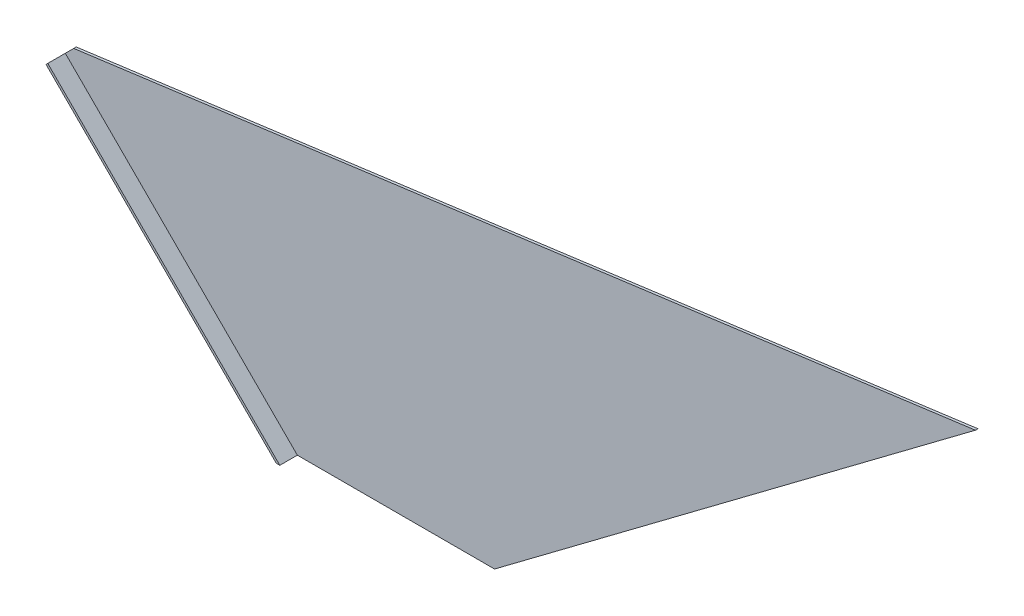
ISO-10303-21;
HEADER;
FILE_DESCRIPTION(('STEP AP214'),'2;1');
FILE_NAME('part.step','',(''),(''),'','','');
FILE_SCHEMA(('AUTOMOTIVE_DESIGN { 1 0 10303 214 1 1 1 1 }'));
ENDSEC;
DATA;
#1=APPLICATION_CONTEXT('core data for automotive mechanical design processes');
#2=APPLICATION_PROTOCOL_DEFINITION('international standard','automotive_design',2000,#1);
#3=PRODUCT_CONTEXT('',#1,'mechanical');
#4=PRODUCT('Part','Part','',(#3));
#5=PRODUCT_RELATED_PRODUCT_CATEGORY('part','',(#4));
#6=PRODUCT_DEFINITION_FORMATION('','',#4);
#7=PRODUCT_DEFINITION_CONTEXT('part definition',#1,'design');
#8=PRODUCT_DEFINITION('design','',#6,#7);
#9=PRODUCT_DEFINITION_SHAPE('','',#8);
#10=(LENGTH_UNIT() NAMED_UNIT(*) SI_UNIT(.MILLI.,.METRE.));
#11=(NAMED_UNIT(*) PLANE_ANGLE_UNIT() SI_UNIT($,.RADIAN.));
#12=(NAMED_UNIT(*) SI_UNIT($,.STERADIAN.) SOLID_ANGLE_UNIT());
#13=UNCERTAINTY_MEASURE_WITH_UNIT(LENGTH_MEASURE(1.E-05),#10,'distance_accuracy_value','');
#14=(GEOMETRIC_REPRESENTATION_CONTEXT(3) GLOBAL_UNCERTAINTY_ASSIGNED_CONTEXT((#13)) GLOBAL_UNIT_ASSIGNED_CONTEXT((#10,
#11,#12)) REPRESENTATION_CONTEXT('',''));
#15=CARTESIAN_POINT('',(0.,0.,0.));
#16=DIRECTION('',(0.,0.,1.));
#17=DIRECTION('',(1.,0.,0.));
#18=AXIS2_PLACEMENT_3D('',#15,#16,#17);
#19=CARTESIAN_POINT('',(0.,0.,1.5875));
#20=DIRECTION('',(0.,1.,0.));
#21=DIRECTION('',(0.,0.,1.));
#22=AXIS2_PLACEMENT_3D('',#19,#20,#21);
#23=PLANE('',#22);
#24=DIRECTION('',(1.,0.,0.));
#25=VECTOR('',#24,1.);
#26=CARTESIAN_POINT('',(0.,0.,0.));
#27=LINE('',#26,#25);
#28=CARTESIAN_POINT('',(-11.1175570778835,0.,0.));
#29=VERTEX_POINT('',#28);
#30=CARTESIAN_POINT('',(114.3,0.,0.));
#31=VERTEX_POINT('',#30);
#32=EDGE_CURVE('E159',#29,#31,#27,.T.);
#33=ORIENTED_EDGE('',*,*,#32,.T.);
#34=DIRECTION('',(0.,0.,-1.));
#35=VECTOR('',#34,1.);
#36=CARTESIAN_POINT('',(114.3,0.,1.5875));
#37=LINE('',#36,#35);
#38=CARTESIAN_POINT('',(114.3,0.,1.5875));
#39=VERTEX_POINT('',#38);
#40=EDGE_CURVE('E11',#39,#31,#37,.T.);
#41=ORIENTED_EDGE('',*,*,#40,.F.);
#42=DIRECTION('',(1.,0.,0.));
#43=VECTOR('',#42,1.);
#44=CARTESIAN_POINT('',(0.,0.,1.5875));
#45=LINE('',#44,#43);
#46=CARTESIAN_POINT('',(-10.6685442718301,0.,1.5875));
#47=VERTEX_POINT('',#46);
#48=EDGE_CURVE('E79',#47,#39,#45,.T.);
#49=ORIENTED_EDGE('',*,*,#48,.F.);
#50=DIRECTION('',(0.,0.,1.));
#51=VECTOR('',#50,1.);
#52=CARTESIAN_POINT('',(-10.6685442718301,0.,12.7));
#53=LINE('',#52,#51);
#54=CARTESIAN_POINT('',(-10.6685442718301,0.,12.7));
#55=VERTEX_POINT('',#54);
#56=EDGE_CURVE('E117',#47,#55,#53,.T.);
#57=ORIENTED_EDGE('',*,*,#56,.T.);
#58=DIRECTION('',(1.,0.,0.));
#59=VECTOR('',#58,1.);
#60=CARTESIAN_POINT('',(0.,0.,12.7));
#61=LINE('',#60,#59);
#62=CARTESIAN_POINT('',(-12.9136083020974,0.,12.7));
#63=VERTEX_POINT('',#62);
#64=EDGE_CURVE('E111',#63,#55,#61,.T.);
#65=ORIENTED_EDGE('',*,*,#64,.F.);
#66=DIRECTION('',(0.,0.,-1.));
#67=VECTOR('',#66,1.);
#68=CARTESIAN_POINT('',(-12.9136083020974,0.,27.1378529991477));
#69=LINE('',#68,#67);
#70=CARTESIAN_POINT('',(-12.9136083020974,0.,1.27));
#71=VERTEX_POINT('',#70);
#72=EDGE_CURVE('E114',#63,#71,#69,.T.);
#73=ORIENTED_EDGE('',*,*,#72,.T.);
#74=CARTESIAN_POINT('',(-11.1175570778835,0.,1.27));
#75=DIRECTION('',(0.,1.,0.));
#76=DIRECTION('',(-1.,0.,0.));
#77=AXIS2_PLACEMENT_3D('',#74,#75,#76);
#78=ELLIPSE('',#77,1.79605122421383,1.27);
#79=EDGE_CURVE('E122',#71,#29,#78,.F.);
#80=ORIENTED_EDGE('',*,*,#79,.T.);
#81=EDGE_LOOP('',(#33,#41,#49,#57,#65,#73,#80));
#82=FACE_BOUND('',#81,.T.);
#83=ADVANCED_FACE('F38',(#82),#23,.F.);
#84=CARTESIAN_POINT('',(114.3,0.,1.5875));
#85=DIRECTION('',(-0.6,0.8,0.));
#86=DIRECTION('',(-0.8,-0.6,0.));
#87=AXIS2_PLACEMENT_3D('',#84,#85,#86);
#88=PLANE('',#87);
#89=DIRECTION('',(0.8,0.6,0.));
#90=VECTOR('',#89,1.);
#91=CARTESIAN_POINT('',(114.3,0.,0.));
#92=LINE('',#91,#90);
#93=CARTESIAN_POINT('',(419.1,228.6,0.));
#94=VERTEX_POINT('',#93);
#95=EDGE_CURVE('E69',#31,#94,#92,.T.);
#96=ORIENTED_EDGE('',*,*,#95,.T.);
#97=DIRECTION('',(0.,0.,-1.));
#98=VECTOR('',#97,1.);
#99=CARTESIAN_POINT('',(419.1,228.6,1.5875));
#100=LINE('',#99,#98);
#101=CARTESIAN_POINT('',(419.1,228.6,1.5875));
#102=VERTEX_POINT('',#101);
#103=EDGE_CURVE('E47',#102,#94,#100,.T.);
#104=ORIENTED_EDGE('',*,*,#103,.F.);
#105=DIRECTION('',(0.8,0.6,0.));
#106=VECTOR('',#105,1.);
#107=CARTESIAN_POINT('',(114.3,0.,1.5875));
#108=LINE('',#107,#106);
#109=EDGE_CURVE('E153',#39,#102,#108,.T.);
#110=ORIENTED_EDGE('',*,*,#109,.F.);
#111=ORIENTED_EDGE('',*,*,#40,.T.);
#112=EDGE_LOOP('',(#96,#104,#110,#111));
#113=FACE_BOUND('',#112,.T.);
#114=ADVANCED_FACE('F203',(#113),#88,.F.);
#115=CARTESIAN_POINT('',(419.1,228.6,1.5875));
#116=DIRECTION('',(0.132163720091018,-0.991227900682635,0.));
#117=DIRECTION('',(0.991227900682635,0.132163720091018,0.));
#118=AXIS2_PLACEMENT_3D('',#115,#116,#117);
#119=PLANE('',#118);
#120=DIRECTION('',(-0.991227900682635,-0.132163720091018,0.));
#121=VECTOR('',#120,1.);
#122=CARTESIAN_POINT('',(419.1,228.6,0.));
#123=LINE('',#122,#121);
#124=CARTESIAN_POINT('',(-152.4,152.4,0.));
#125=VERTEX_POINT('',#124);
#126=EDGE_CURVE('E74',#94,#125,#123,.T.);
#127=ORIENTED_EDGE('',*,*,#126,.T.);
#128=DIRECTION('',(0.,0.,-1.));
#129=VECTOR('',#128,1.);
#130=CARTESIAN_POINT('',(-152.4,152.4,1.5875));
#131=LINE('',#130,#129);
#132=CARTESIAN_POINT('',(-152.4,152.4,1.5875));
#133=VERTEX_POINT('',#132);
#134=EDGE_CURVE('E158',#133,#125,#131,.T.);
#135=ORIENTED_EDGE('',*,*,#134,.F.);
#136=DIRECTION('',(-0.991227900682635,-0.132163720091018,0.));
#137=VECTOR('',#136,1.);
#138=CARTESIAN_POINT('',(419.1,228.6,1.5875));
#139=LINE('',#138,#137);
#140=EDGE_CURVE('E55',#102,#133,#139,.T.);
#141=ORIENTED_EDGE('',*,*,#140,.F.);
#142=ORIENTED_EDGE('',*,*,#103,.T.);
#143=EDGE_LOOP('',(#127,#135,#141,#142));
#144=FACE_BOUND('',#143,.T.);
#145=ADVANCED_FACE('F169',(#144),#119,.F.);
#146=CARTESIAN_POINT('',(0.,0.,1.5875));
#147=DIRECTION('',(0.,0.,1.));
#148=DIRECTION('',(1.,0.,0.));
#149=AXIS2_PLACEMENT_3D('',#146,#147,#148);
#150=PLANE('',#149);
#151=DIRECTION('',(-0.707106781186547,0.707106781186547,0.));
#152=VECTOR('',#151,1.);
#153=CARTESIAN_POINT('',(-5.33427213591503,-5.33427213591514,1.5875));
#154=LINE('',#153,#152);
#155=CARTESIAN_POINT('',(-157.734272135915,147.065727864085,1.5875));
#156=VERTEX_POINT('',#155);
#157=EDGE_CURVE('E142',#47,#156,#154,.T.);
#158=ORIENTED_EDGE('',*,*,#157,.F.);
#159=ORIENTED_EDGE('',*,*,#48,.T.);
#160=ORIENTED_EDGE('',*,*,#109,.T.);
#161=ORIENTED_EDGE('',*,*,#140,.T.);
#162=DIRECTION('',(0.707106781186548,0.707106781186548,0.));
#163=VECTOR('',#162,1.);
#164=CARTESIAN_POINT('',(-152.4,152.4,1.5875));
#165=LINE('',#164,#163);
#166=EDGE_CURVE('E150',#156,#133,#165,.T.);
#167=ORIENTED_EDGE('',*,*,#166,.F.);
#168=EDGE_LOOP('',(#158,#159,#160,#161,#167));
#169=FACE_BOUND('',#168,.T.);
#170=ADVANCED_FACE('F195',(#169),#150,.T.);
#171=CARTESIAN_POINT('',(0.,0.,0.));
#172=DIRECTION('',(0.,0.,1.));
#173=DIRECTION('',(1.,0.,0.));
#174=AXIS2_PLACEMENT_3D('',#171,#172,#173);
#175=PLANE('',#174);
#176=ORIENTED_EDGE('',*,*,#32,.F.);
#177=DIRECTION('',(-0.707106781186547,0.707106781186547,0.));
#178=VECTOR('',#177,1.);
#179=CARTESIAN_POINT('',(-5.55877853894174,-5.55877853894185,0.));
#180=LINE('',#179,#178);
#181=CARTESIAN_POINT('',(-157.958778538942,146.841221461058,0.));
#182=VERTEX_POINT('',#181);
#183=EDGE_CURVE('E144',#29,#182,#180,.T.);
#184=ORIENTED_EDGE('',*,*,#183,.T.);
#185=DIRECTION('',(-0.707106781186548,-0.707106781186548,0.));
#186=VECTOR('',#185,1.);
#187=CARTESIAN_POINT('',(-157.734272135915,147.065727864085,0.));
#188=LINE('',#187,#186);
#189=EDGE_CURVE('E174',#125,#182,#188,.T.);
#190=ORIENTED_EDGE('',*,*,#189,.F.);
#191=ORIENTED_EDGE('',*,*,#126,.F.);
#192=ORIENTED_EDGE('',*,*,#95,.F.);
#193=EDGE_LOOP('',(#176,#184,#190,#191,#192));
#194=FACE_BOUND('',#193,.T.);
#195=ADVANCED_FACE('F172',(#194),#175,.F.);
#196=CARTESIAN_POINT('',(-5.33427213591503,-5.33427213591514,12.7));
#197=DIRECTION('',(0.707106781186547,0.707106781186547,0.));
#198=DIRECTION('',(-0.707106781186548,0.707106781186548,0.));
#199=AXIS2_PLACEMENT_3D('',#196,#197,#198);
#200=PLANE('',#199);
#201=ORIENTED_EDGE('',*,*,#56,.F.);
#202=ORIENTED_EDGE('',*,*,#157,.T.);
#203=DIRECTION('',(0.,0.,-1.));
#204=VECTOR('',#203,1.);
#205=CARTESIAN_POINT('',(-157.734272135915,147.065727864085,12.7));
#206=LINE('',#205,#204);
#207=CARTESIAN_POINT('',(-157.734272135915,147.065727864085,12.7));
#208=VERTEX_POINT('',#207);
#209=EDGE_CURVE('E186',#208,#156,#206,.T.);
#210=ORIENTED_EDGE('',*,*,#209,.F.);
#211=DIRECTION('',(-0.707106781186547,0.707106781186547,0.));
#212=VECTOR('',#211,1.);
#213=CARTESIAN_POINT('',(-5.33427213591503,-5.33427213591514,12.7));
#214=LINE('',#213,#212);
#215=EDGE_CURVE('E138',#55,#208,#214,.T.);
#216=ORIENTED_EDGE('',*,*,#215,.F.);
#217=EDGE_LOOP('',(#201,#202,#210,#216));
#218=FACE_BOUND('',#217,.T.);
#219=ADVANCED_FACE('F194',(#218),#200,.T.);
#220=CARTESIAN_POINT('',(-6.45680415104866,-6.45680415104877,12.7));
#221=DIRECTION('',(0.,0.,1.));
#222=DIRECTION('',(1.,0.,0.));
#223=AXIS2_PLACEMENT_3D('',#220,#221,#222);
#224=PLANE('',#223);
#225=ORIENTED_EDGE('',*,*,#64,.T.);
#226=ORIENTED_EDGE('',*,*,#215,.T.);
#227=DIRECTION('',(0.707106781186548,0.707106781186548,0.));
#228=VECTOR('',#227,1.);
#229=CARTESIAN_POINT('',(-158.856804151049,145.943195848951,12.7));
#230=LINE('',#229,#228);
#231=CARTESIAN_POINT('',(-158.856804151049,145.943195848951,12.7));
#232=VERTEX_POINT('',#231);
#233=EDGE_CURVE('E135',#232,#208,#230,.T.);
#234=ORIENTED_EDGE('',*,*,#233,.F.);
#235=DIRECTION('',(-0.707106781186547,0.707106781186547,0.));
#236=VECTOR('',#235,1.);
#237=CARTESIAN_POINT('',(-6.45680415104866,-6.45680415104877,12.7));
#238=LINE('',#237,#236);
#239=EDGE_CURVE('E128',#63,#232,#238,.T.);
#240=ORIENTED_EDGE('',*,*,#239,.F.);
#241=EDGE_LOOP('',(#225,#226,#234,#240));
#242=FACE_BOUND('',#241,.T.);
#243=ADVANCED_FACE('F133',(#242),#224,.T.);
#244=CARTESIAN_POINT('',(-6.45680415104866,-6.45680415104877,1.27));
#245=DIRECTION('',(-0.707106781186547,-0.707106781186547,0.));
#246=DIRECTION('',(0.707106781186548,-0.707106781186548,0.));
#247=AXIS2_PLACEMENT_3D('',#244,#245,#246);
#248=PLANE('',#247);
#249=ORIENTED_EDGE('',*,*,#72,.F.);
#250=ORIENTED_EDGE('',*,*,#239,.T.);
#251=DIRECTION('',(0.,0.,1.));
#252=VECTOR('',#251,1.);
#253=CARTESIAN_POINT('',(-158.856804151049,145.943195848951,1.27));
#254=LINE('',#253,#252);
#255=CARTESIAN_POINT('',(-158.856804151049,145.943195848951,1.27));
#256=VERTEX_POINT('',#255);
#257=EDGE_CURVE('E286',#256,#232,#254,.T.);
#258=ORIENTED_EDGE('',*,*,#257,.F.);
#259=DIRECTION('',(-0.707106781186547,0.707106781186547,0.));
#260=VECTOR('',#259,1.);
#261=CARTESIAN_POINT('',(-6.45680415104866,-6.45680415104877,1.27));
#262=LINE('',#261,#260);
#263=EDGE_CURVE('E130',#71,#256,#262,.T.);
#264=ORIENTED_EDGE('',*,*,#263,.F.);
#265=EDGE_LOOP('',(#249,#250,#258,#264));
#266=FACE_BOUND('',#265,.T.);
#267=ADVANCED_FACE('F126',(#266),#248,.T.);
#268=CARTESIAN_POINT('',(-5.55877853894174,-5.55877853894185,1.27));
#269=DIRECTION('',(-0.707106781186547,0.707106781186547,0.));
#270=DIRECTION('',(-0.707106781186548,-0.707106781186548,0.));
#271=AXIS2_PLACEMENT_3D('',#268,#269,#270);
#272=CYLINDRICAL_SURFACE('',#271,1.27);
#273=ORIENTED_EDGE('',*,*,#79,.F.);
#274=ORIENTED_EDGE('',*,*,#263,.T.);
#275=CARTESIAN_POINT('',(-157.958778538942,146.841221461058,1.27));
#276=DIRECTION('',(-0.707106781186548,0.707106781186548,0.));
#277=DIRECTION('',(-0.707106781186548,-0.707106781186548,0.));
#278=AXIS2_PLACEMENT_3D('',#275,#276,#277);
#279=CIRCLE('',#278,1.27);
#280=EDGE_CURVE('E180',#182,#256,#279,.T.);
#281=ORIENTED_EDGE('',*,*,#280,.F.);
#282=ORIENTED_EDGE('',*,*,#183,.F.);
#283=EDGE_LOOP('',(#273,#274,#281,#282));
#284=FACE_BOUND('',#283,.T.);
#285=ADVANCED_FACE('F225',(#284),#272,.T.);
#286=CARTESIAN_POINT('',(-157.958778538942,146.841221461058,1.27));
#287=DIRECTION('',(-0.707106781186548,0.707106781186548,0.));
#288=DIRECTION('',(-0.707106781186548,-0.707106781186548,0.));
#289=AXIS2_PLACEMENT_3D('',#286,#287,#288);
#290=PLANE('',#289);
#291=ORIENTED_EDGE('',*,*,#134,.T.);
#292=ORIENTED_EDGE('',*,*,#189,.T.);
#293=ORIENTED_EDGE('',*,*,#280,.T.);
#294=ORIENTED_EDGE('',*,*,#257,.T.);
#295=ORIENTED_EDGE('',*,*,#233,.T.);
#296=ORIENTED_EDGE('',*,*,#209,.T.);
#297=ORIENTED_EDGE('',*,*,#166,.T.);
#298=EDGE_LOOP('',(#291,#292,#293,#294,#295,#296,#297));
#299=FACE_BOUND('',#298,.T.);
#300=ADVANCED_FACE('F183',(#299),#290,.T.);
#301=CLOSED_SHELL('',(#83,#114,#145,#170,#195,#219,#243,#267,#285,#300));
#302=MANIFOLD_SOLID_BREP('B2',#301);
#303=ADVANCED_BREP_SHAPE_REPRESENTATION('',(#18,#302),#14);
#304=SHAPE_DEFINITION_REPRESENTATION(#9,#303);
ENDSEC;
END-ISO-10303-21;
